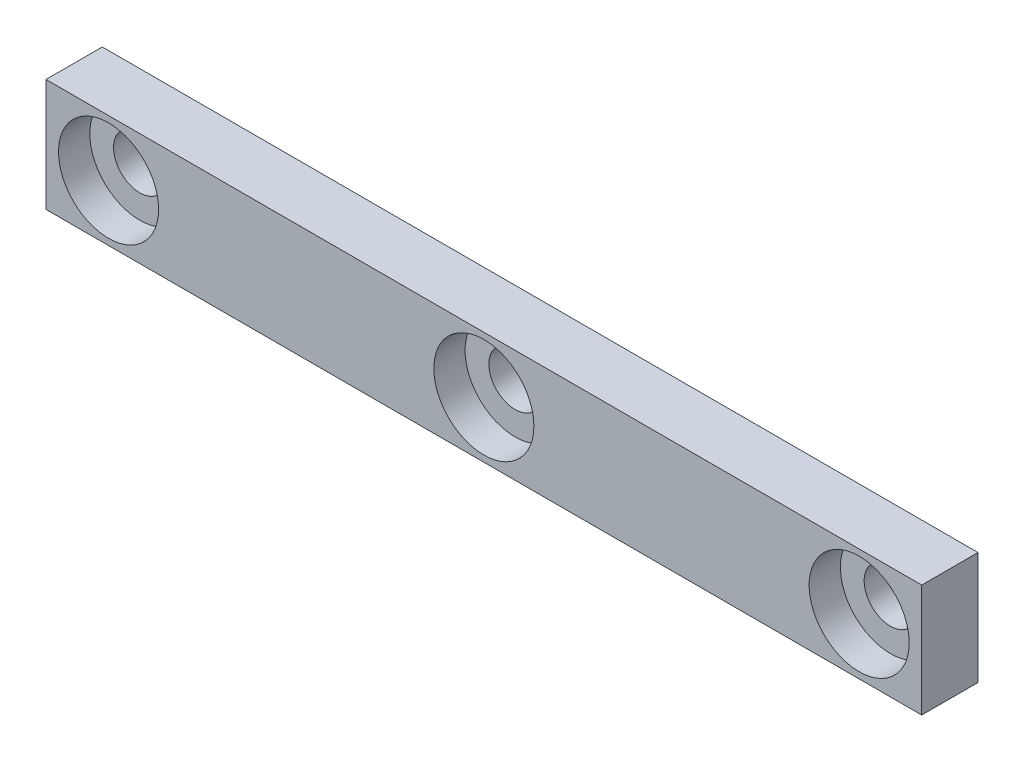
ISO-10303-21;
HEADER;
FILE_DESCRIPTION(('STEP AP214'),'2;1');
FILE_NAME('part.step','',(''),(''),'','','');
FILE_SCHEMA(('AUTOMOTIVE_DESIGN { 1 0 10303 214 1 1 1 1 }'));
ENDSEC;
DATA;
#1=APPLICATION_CONTEXT('core data for automotive mechanical design processes');
#2=APPLICATION_PROTOCOL_DEFINITION('international standard','automotive_design',2000,#1);
#3=PRODUCT_CONTEXT('',#1,'mechanical');
#4=PRODUCT('Part','Part','',(#3));
#5=PRODUCT_RELATED_PRODUCT_CATEGORY('part','',(#4));
#6=PRODUCT_DEFINITION_FORMATION('','',#4);
#7=PRODUCT_DEFINITION_CONTEXT('part definition',#1,'design');
#8=PRODUCT_DEFINITION('design','',#6,#7);
#9=PRODUCT_DEFINITION_SHAPE('','',#8);
#10=(LENGTH_UNIT() NAMED_UNIT(*) SI_UNIT(.MILLI.,.METRE.));
#11=(NAMED_UNIT(*) PLANE_ANGLE_UNIT() SI_UNIT($,.RADIAN.));
#12=(NAMED_UNIT(*) SI_UNIT($,.STERADIAN.) SOLID_ANGLE_UNIT());
#13=UNCERTAINTY_MEASURE_WITH_UNIT(LENGTH_MEASURE(1.E-05),#10,'distance_accuracy_value','');
#14=(GEOMETRIC_REPRESENTATION_CONTEXT(3) GLOBAL_UNCERTAINTY_ASSIGNED_CONTEXT((#13)) GLOBAL_UNIT_ASSIGNED_CONTEXT((#10,
#11,#12)) REPRESENTATION_CONTEXT('',''));
#15=CARTESIAN_POINT('',(0.,0.,0.));
#16=DIRECTION('',(0.,0.,1.));
#17=DIRECTION('',(1.,0.,0.));
#18=AXIS2_PLACEMENT_3D('',#15,#16,#17);
#19=CARTESIAN_POINT('',(-14.3576715102927,-1.65740740740741,4.5));
#20=DIRECTION('',(0.,0.,-1.));
#21=DIRECTION('',(-1.,0.,0.));
#22=AXIS2_PLACEMENT_3D('',#19,#20,#21);
#23=CYLINDRICAL_SURFACE('',#22,2.1);
#24=CARTESIAN_POINT('',(-14.3576715102927,-1.65740740740741,0.));
#25=DIRECTION('',(0.,0.,1.));
#26=DIRECTION('',(1.,0.,0.));
#27=AXIS2_PLACEMENT_3D('',#24,#25,#26);
#28=CIRCLE('',#27,2.1);
#29=CARTESIAN_POINT('',(-12.2576715102927,-1.65740740740741,0.));
#30=VERTEX_POINT('',#29);
#31=EDGE_CURVE('E115',#30,#30,#28,.T.);
#32=ORIENTED_EDGE('',*,*,#31,.F.);
#33=EDGE_LOOP('',(#32));
#34=FACE_BOUND('',#33,.T.);
#35=CARTESIAN_POINT('',(-14.3576715102927,-1.65740740740741,2.));
#36=DIRECTION('',(0.,0.,1.));
#37=DIRECTION('',(1.,0.,0.));
#38=AXIS2_PLACEMENT_3D('',#35,#36,#37);
#39=CIRCLE('',#38,2.1);
#40=CARTESIAN_POINT('',(-12.2576715102927,-1.65740740740741,2.));
#41=VERTEX_POINT('',#40);
#42=EDGE_CURVE('E43',#41,#41,#39,.T.);
#43=ORIENTED_EDGE('',*,*,#42,.T.);
#44=EDGE_LOOP('',(#43));
#45=FACE_BOUND('',#44,.T.);
#46=ADVANCED_FACE('F39',(#34,#45),#23,.F.);
#47=CARTESIAN_POINT('',(15.6423284897073,-1.65740740740741,4.5));
#48=DIRECTION('',(0.,0.,-1.));
#49=DIRECTION('',(-1.,0.,0.));
#50=AXIS2_PLACEMENT_3D('',#47,#48,#49);
#51=CYLINDRICAL_SURFACE('',#50,2.1);
#52=CARTESIAN_POINT('',(15.6423284897073,-1.65740740740741,0.));
#53=DIRECTION('',(0.,0.,1.));
#54=DIRECTION('',(1.,0.,0.));
#55=AXIS2_PLACEMENT_3D('',#52,#53,#54);
#56=CIRCLE('',#55,2.1);
#57=CARTESIAN_POINT('',(17.7423284897073,-1.65740740740741,0.));
#58=VERTEX_POINT('',#57);
#59=EDGE_CURVE('E142',#58,#58,#56,.T.);
#60=ORIENTED_EDGE('',*,*,#59,.F.);
#61=EDGE_LOOP('',(#60));
#62=FACE_BOUND('',#61,.T.);
#63=CARTESIAN_POINT('',(15.6423284897073,-1.65740740740741,2.));
#64=DIRECTION('',(0.,0.,1.));
#65=DIRECTION('',(1.,0.,0.));
#66=AXIS2_PLACEMENT_3D('',#63,#64,#65);
#67=CIRCLE('',#66,2.1);
#68=CARTESIAN_POINT('',(17.7423284897073,-1.65740740740741,2.));
#69=VERTEX_POINT('',#68);
#70=EDGE_CURVE('E129',#69,#69,#67,.T.);
#71=ORIENTED_EDGE('',*,*,#70,.T.);
#72=EDGE_LOOP('',(#71));
#73=FACE_BOUND('',#72,.T.);
#74=ADVANCED_FACE('F162',(#62,#73),#51,.F.);
#75=CARTESIAN_POINT('',(45.6423284897073,-1.65740740740741,4.5));
#76=DIRECTION('',(0.,0.,-1.));
#77=DIRECTION('',(-1.,0.,0.));
#78=AXIS2_PLACEMENT_3D('',#75,#76,#77);
#79=CYLINDRICAL_SURFACE('',#78,2.1);
#80=CARTESIAN_POINT('',(45.6423284897073,-1.65740740740741,0.));
#81=DIRECTION('',(0.,0.,1.));
#82=DIRECTION('',(1.,0.,0.));
#83=AXIS2_PLACEMENT_3D('',#80,#81,#82);
#84=CIRCLE('',#83,2.1);
#85=CARTESIAN_POINT('',(47.7423284897073,-1.65740740740741,0.));
#86=VERTEX_POINT('',#85);
#87=EDGE_CURVE('E137',#86,#86,#84,.T.);
#88=ORIENTED_EDGE('',*,*,#87,.F.);
#89=EDGE_LOOP('',(#88));
#90=FACE_BOUND('',#89,.T.);
#91=CARTESIAN_POINT('',(45.6423284897073,-1.65740740740741,2.));
#92=DIRECTION('',(0.,0.,1.));
#93=DIRECTION('',(1.,0.,0.));
#94=AXIS2_PLACEMENT_3D('',#91,#92,#93);
#95=CIRCLE('',#94,2.1);
#96=CARTESIAN_POINT('',(47.7423284897073,-1.65740740740741,2.));
#97=VERTEX_POINT('',#96);
#98=EDGE_CURVE('E126',#97,#97,#95,.T.);
#99=ORIENTED_EDGE('',*,*,#98,.T.);
#100=EDGE_LOOP('',(#99));
#101=FACE_BOUND('',#100,.T.);
#102=ADVANCED_FACE('F167',(#90,#101),#79,.F.);
#103=CARTESIAN_POINT('',(0.,0.,4.5));
#104=DIRECTION('',(0.,0.,1.));
#105=DIRECTION('',(1.,0.,0.));
#106=AXIS2_PLACEMENT_3D('',#103,#104,#105);
#107=PLANE('',#106);
#108=CARTESIAN_POINT('',(-14.3576715102927,-1.65740740740741,4.5));
#109=DIRECTION('',(0.,0.,1.));
#110=DIRECTION('',(1.,0.,0.));
#111=AXIS2_PLACEMENT_3D('',#108,#109,#110);
#112=CIRCLE('',#111,4.);
#113=CARTESIAN_POINT('',(-10.3576715102927,-1.65740740740741,4.5));
#114=VERTEX_POINT('',#113);
#115=EDGE_CURVE('E302',#114,#114,#112,.T.);
#116=ORIENTED_EDGE('',*,*,#115,.F.);
#117=EDGE_LOOP('',(#116));
#118=FACE_BOUND('',#117,.T.);
#119=CARTESIAN_POINT('',(15.6423284897073,-1.65740740740741,4.5));
#120=DIRECTION('',(0.,0.,1.));
#121=DIRECTION('',(1.,0.,0.));
#122=AXIS2_PLACEMENT_3D('',#119,#120,#121);
#123=CIRCLE('',#122,4.);
#124=CARTESIAN_POINT('',(19.6423284897073,-1.65740740740741,4.5));
#125=VERTEX_POINT('',#124);
#126=EDGE_CURVE('E312',#125,#125,#123,.T.);
#127=ORIENTED_EDGE('',*,*,#126,.F.);
#128=EDGE_LOOP('',(#127));
#129=FACE_BOUND('',#128,.T.);
#130=CARTESIAN_POINT('',(45.6423284897073,-1.65740740740741,4.5));
#131=DIRECTION('',(0.,0.,1.));
#132=DIRECTION('',(1.,0.,0.));
#133=AXIS2_PLACEMENT_3D('',#130,#131,#132);
#134=CIRCLE('',#133,4.);
#135=CARTESIAN_POINT('',(49.6423284897073,-1.65740740740741,4.5));
#136=VERTEX_POINT('',#135);
#137=EDGE_CURVE('E150',#136,#136,#134,.T.);
#138=ORIENTED_EDGE('',*,*,#137,.F.);
#139=EDGE_LOOP('',(#138));
#140=FACE_BOUND('',#139,.T.);
#141=DIRECTION('',(0.,-1.,0.));
#142=VECTOR('',#141,1.);
#143=CARTESIAN_POINT('',(-19.3576715102927,2.84259259259259,4.5));
#144=LINE('',#143,#142);
#145=CARTESIAN_POINT('',(-19.3576715102927,2.84259259259259,4.5));
#146=VERTEX_POINT('',#145);
#147=CARTESIAN_POINT('',(-19.3576715102927,-6.15740740740741,4.5));
#148=VERTEX_POINT('',#147);
#149=EDGE_CURVE('E94',#146,#148,#144,.T.);
#150=ORIENTED_EDGE('',*,*,#149,.T.);
#151=DIRECTION('',(1.,0.,0.));
#152=VECTOR('',#151,1.);
#153=CARTESIAN_POINT('',(-19.3576715102927,-6.15740740740741,4.5));
#154=LINE('',#153,#152);
#155=CARTESIAN_POINT('',(50.6423284897073,-6.15740740740741,4.5));
#156=VERTEX_POINT('',#155);
#157=EDGE_CURVE('E89',#148,#156,#154,.T.);
#158=ORIENTED_EDGE('',*,*,#157,.T.);
#159=DIRECTION('',(0.,1.,0.));
#160=VECTOR('',#159,1.);
#161=CARTESIAN_POINT('',(50.6423284897073,2.84259259259259,4.5));
#162=LINE('',#161,#160);
#163=CARTESIAN_POINT('',(50.6423284897073,2.84259259259259,4.5));
#164=VERTEX_POINT('',#163);
#165=EDGE_CURVE('E92',#156,#164,#162,.T.);
#166=ORIENTED_EDGE('',*,*,#165,.T.);
#167=DIRECTION('',(-1.,0.,0.));
#168=VECTOR('',#167,1.);
#169=CARTESIAN_POINT('',(-19.3576715102927,2.84259259259259,4.5));
#170=LINE('',#169,#168);
#171=EDGE_CURVE('E59',#164,#146,#170,.T.);
#172=ORIENTED_EDGE('',*,*,#171,.T.);
#173=EDGE_LOOP('',(#150,#158,#166,#172));
#174=FACE_BOUND('',#173,.T.);
#175=ADVANCED_FACE('F90',(#118,#129,#140,#174),#107,.T.);
#176=CARTESIAN_POINT('',(0.,0.,0.));
#177=DIRECTION('',(0.,0.,1.));
#178=DIRECTION('',(1.,0.,0.));
#179=AXIS2_PLACEMENT_3D('',#176,#177,#178);
#180=PLANE('',#179);
#181=DIRECTION('',(0.,-1.,0.));
#182=VECTOR('',#181,1.);
#183=CARTESIAN_POINT('',(-19.3576715102927,2.84259259259259,0.));
#184=LINE('',#183,#182);
#185=CARTESIAN_POINT('',(-19.3576715102927,2.84259259259259,0.));
#186=VERTEX_POINT('',#185);
#187=CARTESIAN_POINT('',(-19.3576715102927,-6.15740740740741,0.));
#188=VERTEX_POINT('',#187);
#189=EDGE_CURVE('E111',#186,#188,#184,.T.);
#190=ORIENTED_EDGE('',*,*,#189,.F.);
#191=DIRECTION('',(-1.,0.,0.));
#192=VECTOR('',#191,1.);
#193=CARTESIAN_POINT('',(-19.3576715102927,2.84259259259259,0.));
#194=LINE('',#193,#192);
#195=CARTESIAN_POINT('',(50.6423284897073,2.84259259259259,0.));
#196=VERTEX_POINT('',#195);
#197=EDGE_CURVE('E82',#196,#186,#194,.T.);
#198=ORIENTED_EDGE('',*,*,#197,.F.);
#199=DIRECTION('',(0.,1.,0.));
#200=VECTOR('',#199,1.);
#201=CARTESIAN_POINT('',(50.6423284897073,2.84259259259259,0.));
#202=LINE('',#201,#200);
#203=CARTESIAN_POINT('',(50.6423284897073,-6.15740740740741,0.));
#204=VERTEX_POINT('',#203);
#205=EDGE_CURVE('E76',#204,#196,#202,.T.);
#206=ORIENTED_EDGE('',*,*,#205,.F.);
#207=DIRECTION('',(1.,0.,0.));
#208=VECTOR('',#207,1.);
#209=CARTESIAN_POINT('',(-19.3576715102927,-6.15740740740741,0.));
#210=LINE('',#209,#208);
#211=EDGE_CURVE('E99',#188,#204,#210,.T.);
#212=ORIENTED_EDGE('',*,*,#211,.F.);
#213=EDGE_LOOP('',(#190,#198,#206,#212));
#214=FACE_BOUND('',#213,.T.);
#215=ORIENTED_EDGE('',*,*,#31,.T.);
#216=EDGE_LOOP('',(#215));
#217=FACE_BOUND('',#216,.T.);
#218=ORIENTED_EDGE('',*,*,#59,.T.);
#219=EDGE_LOOP('',(#218));
#220=FACE_BOUND('',#219,.T.);
#221=ORIENTED_EDGE('',*,*,#87,.T.);
#222=EDGE_LOOP('',(#221));
#223=FACE_BOUND('',#222,.T.);
#224=ADVANCED_FACE('F158',(#214,#217,#220,#223),#180,.F.);
#225=CARTESIAN_POINT('',(-19.3576715102927,2.84259259259259,4.5));
#226=DIRECTION('',(1.,0.,0.));
#227=DIRECTION('',(0.,0.,-1.));
#228=AXIS2_PLACEMENT_3D('',#225,#226,#227);
#229=PLANE('',#228);
#230=ORIENTED_EDGE('',*,*,#189,.T.);
#231=DIRECTION('',(0.,0.,-1.));
#232=VECTOR('',#231,1.);
#233=CARTESIAN_POINT('',(-19.3576715102927,-6.15740740740741,4.5));
#234=LINE('',#233,#232);
#235=EDGE_CURVE('E11',#148,#188,#234,.T.);
#236=ORIENTED_EDGE('',*,*,#235,.F.);
#237=ORIENTED_EDGE('',*,*,#149,.F.);
#238=DIRECTION('',(0.,0.,-1.));
#239=VECTOR('',#238,1.);
#240=CARTESIAN_POINT('',(-19.3576715102927,2.84259259259259,4.5));
#241=LINE('',#240,#239);
#242=EDGE_CURVE('E107',#146,#186,#241,.T.);
#243=ORIENTED_EDGE('',*,*,#242,.T.);
#244=EDGE_LOOP('',(#230,#236,#237,#243));
#245=FACE_BOUND('',#244,.T.);
#246=ADVANCED_FACE('F41',(#245),#229,.F.);
#247=CARTESIAN_POINT('',(-19.3576715102927,-6.15740740740741,4.5));
#248=DIRECTION('',(0.,1.,0.));
#249=DIRECTION('',(0.,0.,1.));
#250=AXIS2_PLACEMENT_3D('',#247,#248,#249);
#251=PLANE('',#250);
#252=ORIENTED_EDGE('',*,*,#211,.T.);
#253=DIRECTION('',(0.,0.,-1.));
#254=VECTOR('',#253,1.);
#255=CARTESIAN_POINT('',(50.6423284897073,-6.15740740740741,4.5));
#256=LINE('',#255,#254);
#257=EDGE_CURVE('E50',#156,#204,#256,.T.);
#258=ORIENTED_EDGE('',*,*,#257,.F.);
#259=ORIENTED_EDGE('',*,*,#157,.F.);
#260=ORIENTED_EDGE('',*,*,#235,.T.);
#261=EDGE_LOOP('',(#252,#258,#259,#260));
#262=FACE_BOUND('',#261,.T.);
#263=ADVANCED_FACE('F98',(#262),#251,.F.);
#264=CARTESIAN_POINT('',(50.6423284897073,2.84259259259259,4.5));
#265=DIRECTION('',(-1.,0.,0.));
#266=DIRECTION('',(0.,0.,1.));
#267=AXIS2_PLACEMENT_3D('',#264,#265,#266);
#268=PLANE('',#267);
#269=ORIENTED_EDGE('',*,*,#205,.T.);
#270=DIRECTION('',(0.,0.,-1.));
#271=VECTOR('',#270,1.);
#272=CARTESIAN_POINT('',(50.6423284897073,2.84259259259259,4.5));
#273=LINE('',#272,#271);
#274=EDGE_CURVE('E101',#164,#196,#273,.T.);
#275=ORIENTED_EDGE('',*,*,#274,.F.);
#276=ORIENTED_EDGE('',*,*,#165,.F.);
#277=ORIENTED_EDGE('',*,*,#257,.T.);
#278=EDGE_LOOP('',(#269,#275,#276,#277));
#279=FACE_BOUND('',#278,.T.);
#280=ADVANCED_FACE('F103',(#279),#268,.F.);
#281=CARTESIAN_POINT('',(-19.3576715102927,2.84259259259259,4.5));
#282=DIRECTION('',(0.,-1.,0.));
#283=DIRECTION('',(0.,0.,-1.));
#284=AXIS2_PLACEMENT_3D('',#281,#282,#283);
#285=PLANE('',#284);
#286=ORIENTED_EDGE('',*,*,#197,.T.);
#287=ORIENTED_EDGE('',*,*,#242,.F.);
#288=ORIENTED_EDGE('',*,*,#171,.F.);
#289=ORIENTED_EDGE('',*,*,#274,.T.);
#290=EDGE_LOOP('',(#286,#287,#288,#289));
#291=FACE_BOUND('',#290,.T.);
#292=ADVANCED_FACE('F178',(#291),#285,.F.);
#293=CARTESIAN_POINT('',(45.6423284897073,-1.65740740740741,2.));
#294=DIRECTION('',(0.,0.,1.));
#295=DIRECTION('',(1.,0.,0.));
#296=AXIS2_PLACEMENT_3D('',#293,#294,#295);
#297=CYLINDRICAL_SURFACE('',#296,4.);
#298=CARTESIAN_POINT('',(45.6423284897073,-1.65740740740741,2.));
#299=DIRECTION('',(0.,0.,1.));
#300=DIRECTION('',(1.,0.,0.));
#301=AXIS2_PLACEMENT_3D('',#298,#299,#300);
#302=CIRCLE('',#301,4.);
#303=CARTESIAN_POINT('',(49.6423284897073,-1.65740740740741,2.));
#304=VERTEX_POINT('',#303);
#305=EDGE_CURVE('E315',#304,#304,#302,.T.);
#306=ORIENTED_EDGE('',*,*,#305,.F.);
#307=EDGE_LOOP('',(#306));
#308=FACE_BOUND('',#307,.T.);
#309=ORIENTED_EDGE('',*,*,#137,.T.);
#310=EDGE_LOOP('',(#309));
#311=FACE_BOUND('',#310,.T.);
#312=ADVANCED_FACE('F181',(#308,#311),#297,.F.);
#313=CARTESIAN_POINT('',(45.6423284897073,-1.65740740740741,2.));
#314=DIRECTION('',(0.,0.,1.));
#315=DIRECTION('',(1.,0.,0.));
#316=AXIS2_PLACEMENT_3D('',#313,#314,#315);
#317=PLANE('',#316);
#318=ORIENTED_EDGE('',*,*,#98,.F.);
#319=EDGE_LOOP('',(#318));
#320=FACE_BOUND('',#319,.T.);
#321=ORIENTED_EDGE('',*,*,#305,.T.);
#322=EDGE_LOOP('',(#321));
#323=FACE_BOUND('',#322,.T.);
#324=ADVANCED_FACE('F244',(#320,#323),#317,.T.);
#325=CARTESIAN_POINT('',(15.6423284897073,-1.65740740740741,2.));
#326=DIRECTION('',(0.,0.,1.));
#327=DIRECTION('',(1.,0.,0.));
#328=AXIS2_PLACEMENT_3D('',#325,#326,#327);
#329=CYLINDRICAL_SURFACE('',#328,4.);
#330=CARTESIAN_POINT('',(15.6423284897073,-1.65740740740741,2.));
#331=DIRECTION('',(0.,0.,1.));
#332=DIRECTION('',(1.,0.,0.));
#333=AXIS2_PLACEMENT_3D('',#330,#331,#332);
#334=CIRCLE('',#333,4.);
#335=CARTESIAN_POINT('',(19.6423284897073,-1.65740740740741,2.));
#336=VERTEX_POINT('',#335);
#337=EDGE_CURVE('E306',#336,#336,#334,.T.);
#338=ORIENTED_EDGE('',*,*,#337,.F.);
#339=EDGE_LOOP('',(#338));
#340=FACE_BOUND('',#339,.T.);
#341=ORIENTED_EDGE('',*,*,#126,.T.);
#342=EDGE_LOOP('',(#341));
#343=FACE_BOUND('',#342,.T.);
#344=ADVANCED_FACE('F251',(#340,#343),#329,.F.);
#345=CARTESIAN_POINT('',(15.6423284897073,-1.65740740740741,2.));
#346=DIRECTION('',(0.,0.,1.));
#347=DIRECTION('',(1.,0.,0.));
#348=AXIS2_PLACEMENT_3D('',#345,#346,#347);
#349=PLANE('',#348);
#350=ORIENTED_EDGE('',*,*,#70,.F.);
#351=EDGE_LOOP('',(#350));
#352=FACE_BOUND('',#351,.T.);
#353=ORIENTED_EDGE('',*,*,#337,.T.);
#354=EDGE_LOOP('',(#353));
#355=FACE_BOUND('',#354,.T.);
#356=ADVANCED_FACE('F259',(#352,#355),#349,.T.);
#357=CARTESIAN_POINT('',(-14.3576715102927,-1.65740740740741,2.));
#358=DIRECTION('',(0.,0.,1.));
#359=DIRECTION('',(1.,0.,0.));
#360=AXIS2_PLACEMENT_3D('',#357,#358,#359);
#361=CYLINDRICAL_SURFACE('',#360,4.);
#362=CARTESIAN_POINT('',(-14.3576715102927,-1.65740740740741,2.));
#363=DIRECTION('',(0.,0.,1.));
#364=DIRECTION('',(1.,0.,0.));
#365=AXIS2_PLACEMENT_3D('',#362,#363,#364);
#366=CIRCLE('',#365,4.);
#367=CARTESIAN_POINT('',(-10.3576715102927,-1.65740740740741,2.));
#368=VERTEX_POINT('',#367);
#369=EDGE_CURVE('E130',#368,#368,#366,.T.);
#370=ORIENTED_EDGE('',*,*,#369,.F.);
#371=EDGE_LOOP('',(#370));
#372=FACE_BOUND('',#371,.T.);
#373=ORIENTED_EDGE('',*,*,#115,.T.);
#374=EDGE_LOOP('',(#373));
#375=FACE_BOUND('',#374,.T.);
#376=ADVANCED_FACE('F267',(#372,#375),#361,.F.);
#377=CARTESIAN_POINT('',(-14.3576715102927,-1.65740740740741,2.));
#378=DIRECTION('',(0.,0.,1.));
#379=DIRECTION('',(1.,0.,0.));
#380=AXIS2_PLACEMENT_3D('',#377,#378,#379);
#381=PLANE('',#380);
#382=ORIENTED_EDGE('',*,*,#42,.F.);
#383=EDGE_LOOP('',(#382));
#384=FACE_BOUND('',#383,.T.);
#385=ORIENTED_EDGE('',*,*,#369,.T.);
#386=EDGE_LOOP('',(#385));
#387=FACE_BOUND('',#386,.T.);
#388=ADVANCED_FACE('F275',(#384,#387),#381,.T.);
#389=CLOSED_SHELL('',(#46,#74,#102,#175,#224,#246,#263,#280,#292,#312,#324,#344,#356,#376,#388));
#390=MANIFOLD_SOLID_BREP('B2',#389);
#391=ADVANCED_BREP_SHAPE_REPRESENTATION('',(#18,#390),#14);
#392=SHAPE_DEFINITION_REPRESENTATION(#9,#391);
ENDSEC;
END-ISO-10303-21;
